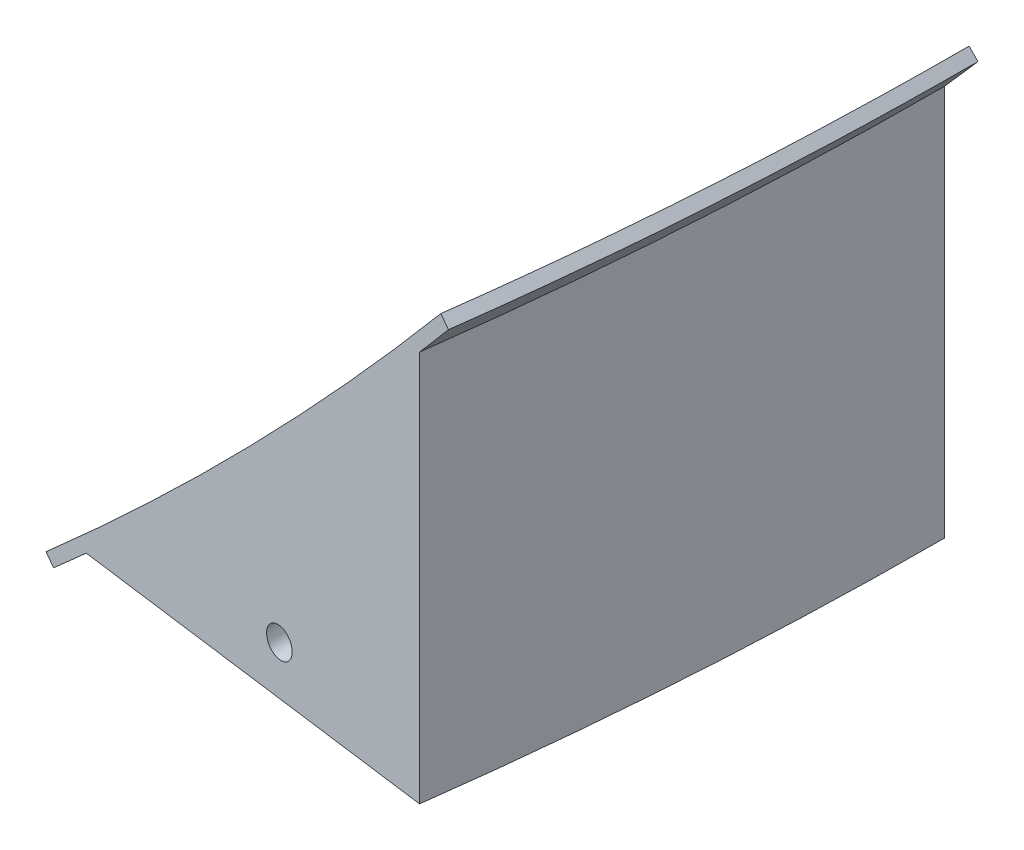
ISO-10303-21;
HEADER;
FILE_DESCRIPTION(('STEP AP214'),'2;1');
FILE_NAME('part.step','',(''),(''),'','','');
FILE_SCHEMA(('AUTOMOTIVE_DESIGN { 1 0 10303 214 1 1 1 1 }'));
ENDSEC;
DATA;
#1=APPLICATION_CONTEXT('core data for automotive mechanical design processes');
#2=APPLICATION_PROTOCOL_DEFINITION('international standard','automotive_design',2000,#1);
#3=PRODUCT_CONTEXT('',#1,'mechanical');
#4=PRODUCT('Part','Part','',(#3));
#5=PRODUCT_RELATED_PRODUCT_CATEGORY('part','',(#4));
#6=PRODUCT_DEFINITION_FORMATION('','',#4);
#7=PRODUCT_DEFINITION_CONTEXT('part definition',#1,'design');
#8=PRODUCT_DEFINITION('design','',#6,#7);
#9=PRODUCT_DEFINITION_SHAPE('','',#8);
#10=(LENGTH_UNIT() NAMED_UNIT(*) SI_UNIT(.MILLI.,.METRE.));
#11=(NAMED_UNIT(*) PLANE_ANGLE_UNIT() SI_UNIT($,.RADIAN.));
#12=(NAMED_UNIT(*) SI_UNIT($,.STERADIAN.) SOLID_ANGLE_UNIT());
#13=UNCERTAINTY_MEASURE_WITH_UNIT(LENGTH_MEASURE(1.E-05),#10,'distance_accuracy_value','');
#14=(GEOMETRIC_REPRESENTATION_CONTEXT(3) GLOBAL_UNCERTAINTY_ASSIGNED_CONTEXT((#13)) GLOBAL_UNIT_ASSIGNED_CONTEXT((#10,
#11,#12)) REPRESENTATION_CONTEXT('',''));
#15=CARTESIAN_POINT('',(0.,0.,0.));
#16=DIRECTION('',(0.,0.,1.));
#17=DIRECTION('',(1.,0.,0.));
#18=AXIS2_PLACEMENT_3D('',#15,#16,#17);
#19=CARTESIAN_POINT('',(0.,0.,0.));
#20=DIRECTION('',(0.,1.,0.));
#21=DIRECTION('',(0.99144486137381,0.,0.130526192220052));
#22=AXIS2_PLACEMENT_3D('',#19,#20,#21);
#23=SPHERICAL_SURFACE('',#22,990.6);
#24=CARTESIAN_POINT('',(0.,0.,0.));
#25=DIRECTION('',(0.,0.,-1.));
#26=DIRECTION('',(-1.,0.,0.));
#27=AXIS2_PLACEMENT_3D('',#24,#25,#26);
#28=CIRCLE('',#27,990.6);
#29=CARTESIAN_POINT('',(747.83996089819,-649.633552769401,0.));
#30=VERTEX_POINT('',#29);
#31=CARTESIAN_POINT('',(657.550535136958,-740.888421924044,0.));
#32=VERTEX_POINT('',#31);
#33=EDGE_CURVE('E130',#30,#32,#28,.T.);
#34=ORIENTED_EDGE('',*,*,#33,.T.);
#35=CARTESIAN_POINT('',(657.550535136958,-740.888421924044,0.));
#36=CARTESIAN_POINT('',(657.550536091288,-740.888423268421,3.59944655148366));
#37=CARTESIAN_POINT('',(657.52102394074,-740.888382851914,7.19888875757097));
#38=CARTESIAN_POINT('',(657.403000127714,-740.888212828207,14.3967455764021));
#39=CARTESIAN_POINT('',(657.31448945183,-740.8880832225,17.9951602053228));
#40=CARTESIAN_POINT('',(657.078495278586,-740.887729151888,25.1900635834792));
#41=CARTESIAN_POINT('',(656.931011778394,-740.887504686979,28.7865523326225));
#42=CARTESIAN_POINT('',(656.577109024732,-740.886966509601,35.976655543251));
#43=CARTESIAN_POINT('',(656.370688794431,-740.886652795653,39.5702699561062));
#44=CARTESIAN_POINT('',(655.666524765914,-740.885594755832,50.2927849919093));
#45=CARTESIAN_POINT('',(655.082138709881,-740.884730711083,57.4161792530851));
#46=CARTESIAN_POINT('',(653.681815145169,-740.882648434884,71.6411227293097));
#47=CARTESIAN_POINT('',(652.865847031347,-740.881430156619,78.7426689315129));
#48=CARTESIAN_POINT('',(651.93448684455,-740.880018194558,85.8288034564424));
#49=B_SPLINE_CURVE_WITH_KNOTS('',3,(#35,#36,#37,#38,#39,#40,#41,#42,#43,#44,#45,#46,#47,#48),
.UNSPECIFIED.,.F.,.F.,(4,2,2,2,2,2,4),(0.,10.7982101222248,21.5962396776766,32.3942697517743,
43.1924788053286,64.6304225738239,86.071200832552),.UNSPECIFIED.);
#50=CARTESIAN_POINT('',(651.93448684455,-740.880018194558,85.8288034564424));
#51=VERTEX_POINT('',#50);
#52=EDGE_CURVE('E52',#32,#51,#49,.T.);
#53=ORIENTED_EDGE('',*,*,#52,.T.);
#54=CARTESIAN_POINT('',(0.,0.,0.));
#55=DIRECTION('',(0.130526192220052,0.,-0.99144486137381));
#56=DIRECTION('',(-0.99144486137381,0.,-0.130526192220052));
#57=AXIS2_PLACEMENT_3D('',#54,#55,#56);
#58=CIRCLE('',#57,990.6);
#59=CARTESIAN_POINT('',(741.451031699921,-649.623166143906,97.6138801620462));
#60=VERTEX_POINT('',#59);
#61=EDGE_CURVE('E132',#60,#51,#58,.T.);
#62=ORIENTED_EDGE('',*,*,#61,.F.);
#63=CARTESIAN_POINT('',(741.451031699921,-649.623166143906,97.6138801620462));
#64=CARTESIAN_POINT('',(741.984510847553,-649.624045061227,93.5558755083255));
#65=CARTESIAN_POINT('',(742.484716606062,-649.624869657589,89.4935039820626));
#66=CARTESIAN_POINT('',(743.418457868094,-649.626405045488,81.3611748245032));
#67=CARTESIAN_POINT('',(743.851994486663,-649.627115838928,77.2912173212353));
#68=CARTESIAN_POINT('',(744.652291872864,-649.628418487868,69.144727755465));
#69=CARTESIAN_POINT('',(745.01905263613,-649.62901034336,65.0681956925327));
#70=CARTESIAN_POINT('',(745.685698029203,-649.630082374367,56.9096561255928));
#71=CARTESIAN_POINT('',(745.98558154992,-649.63056254803,52.8276485319083));
#72=CARTESIAN_POINT('',(746.781069574519,-649.631847518431,40.6316312358823));
#73=CARTESIAN_POINT('',(747.17808028781,-649.632505524804,32.5108746276513));
#74=CARTESIAN_POINT('',(747.575169172641,-649.633145785505,20.3231823803407));
#75=CARTESIAN_POINT('',(747.674460940531,-649.633301412712,16.2591713583255));
#76=CARTESIAN_POINT('',(747.806854921753,-649.633505422877,8.13014109860808));
#77=CARTESIAN_POINT('',(747.839958271164,-649.633553807675,4.06512187940866));
#78=CARTESIAN_POINT('',(747.839960898189,-649.633552769401,0.));
#79=B_SPLINE_CURVE_WITH_KNOTS('',3,(#63,#64,#65,#66,#67,#68,#69,#70,#71,#72,#73,#74,#75,#76,#77,
#78),.UNSPECIFIED.,.F.,.F.,(4,2,2,2,2,2,2,4),(0.,12.2786110484196,24.5570167136157,
36.8354231814184,49.1140332589345,73.5002565560423,85.6954915364311,97.890517192474),.UNSPECIFIED.);
#80=EDGE_CURVE('E119',#60,#30,#79,.T.);
#81=ORIENTED_EDGE('',*,*,#80,.T.);
#82=EDGE_LOOP('',(#34,#53,#62,#81));
#83=FACE_BOUND('',#82,.T.);
#84=ADVANCED_FACE('F36',(#83),#23,.F.);
#85=CARTESIAN_POINT('',(0.,0.,0.));
#86=DIRECTION('',(0.,1.,0.));
#87=DIRECTION('',(0.99144486137381,0.,0.130526192220052));
#88=AXIS2_PLACEMENT_3D('',#85,#86,#87);
#89=SPHERICAL_SURFACE('',#88,993.075249624413);
#90=CARTESIAN_POINT('',(0.,0.,0.));
#91=DIRECTION('',(0.,0.,1.));
#92=DIRECTION('',(1.,0.,0.));
#93=AXIS2_PLACEMENT_3D('',#90,#91,#92);
#94=CIRCLE('',#93,993.075249624413);
#95=CARTESIAN_POINT('',(742.97310069151,-658.93051459576,0.));
#96=VERTEX_POINT('',#95);
#97=CARTESIAN_POINT('',(749.586604116427,-651.397247726602,0.));
#98=VERTEX_POINT('',#97);
#99=EDGE_CURVE('E153',#96,#98,#94,.T.);
#100=ORIENTED_EDGE('',*,*,#99,.T.);
#101=CARTESIAN_POINT('',(749.586604116427,-651.397247726602,0.));
#102=CARTESIAN_POINT('',(749.586605454425,-651.39724931977,4.09291958061841));
#103=CARTESIAN_POINT('',(749.553086488586,-651.397242102042,8.18583179006925));
#104=CARTESIAN_POINT('',(749.419036707602,-651.397203164307,16.3704898044526));
#105=CARTESIAN_POINT('',(749.318507020358,-651.397171444712,20.4622356278576));
#106=CARTESIAN_POINT('',(749.050464545899,-651.397076623271,28.6435472781627));
#107=CARTESIAN_POINT('',(748.882951755089,-651.397013521423,32.7331131049456));
#108=CARTESIAN_POINT('',(748.48098858665,-651.396861275789,40.9089646871464));
#109=CARTESIAN_POINT('',(748.24653709277,-651.396772131569,44.995250386726));
#110=CARTESIAN_POINT('',(747.444054794308,-651.396482655785,57.2289376037594));
#111=CARTESIAN_POINT('',(746.77627464116,-651.396259972327,65.3701179579835));
#112=CARTESIAN_POINT('',(745.575415560947,-651.395820726485,77.5623649925912));
#113=CARTESIAN_POINT('',(745.141884170866,-651.39565675538,81.6235497191031));
#114=CARTESIAN_POINT('',(744.208534428882,-651.395300763418,89.7382234113944));
#115=CARTESIAN_POINT('',(743.708717228914,-651.395108743048,93.7917125096693));
#116=CARTESIAN_POINT('',(743.17580419077,-651.394906208791,97.8409507682365));
#117=B_SPLINE_CURVE_WITH_KNOTS('',3,(#101,#102,#103,#104,#105,#106,#107,#108,#109,#110,#111,
#112,#113,#114,#115,#116),.UNSPECIFIED.,.F.,.F.,(4,2,2,2,2,2,2,4),(0.,12.2786068912708,
24.5570071184778,36.8354080046885,49.1140136541446,73.6143741756836,85.8667096631725,
98.1188322538009),.UNSPECIFIED.);
#118=CARTESIAN_POINT('',(743.17580419077,-651.394906208791,97.8409507682365));
#119=VERTEX_POINT('',#118);
#120=EDGE_CURVE('E60',#98,#119,#117,.T.);
#121=ORIENTED_EDGE('',*,*,#120,.T.);
#122=CARTESIAN_POINT('',(0.,0.,0.));
#123=DIRECTION('',(-0.130526192220052,0.,0.99144486137381));
#124=DIRECTION('',(0.99144486137381,0.,0.130526192220052));
#125=AXIS2_PLACEMENT_3D('',#122,#123,#124);
#126=CIRCLE('',#125,993.075249624413);
#127=CARTESIAN_POINT('',(736.616862819564,-658.93051459576,96.977449755188));
#128=VERTEX_POINT('',#127);
#129=EDGE_CURVE('E164',#128,#119,#126,.T.);
#130=ORIENTED_EDGE('',*,*,#129,.F.);
#131=CARTESIAN_POINT('',(2.02009226479567E-13,-658.93051459576,0.));
#132=DIRECTION('',(0.,1.,0.));
#133=DIRECTION('',(-1.,0.,0.));
#134=AXIS2_PLACEMENT_3D('',#131,#132,#133);
#135=CIRCLE('',#134,742.97310069151);
#136=EDGE_CURVE('E125',#128,#96,#135,.T.);
#137=ORIENTED_EDGE('',*,*,#136,.T.);
#138=EDGE_LOOP('',(#100,#121,#130,#137));
#139=FACE_BOUND('',#138,.T.);
#140=ADVANCED_FACE('F38',(#139),#89,.T.);
#141=CARTESIAN_POINT('',(0.,993.075249624412,0.));
#142=DIRECTION('',(0.,1.,0.));
#143=DIRECTION('',(-1.,0.,0.));
#144=AXIS2_PLACEMENT_3D('',#141,#142,#143);
#145=CYLINDRICAL_SURFACE('',#144,742.97310069151);
#146=CARTESIAN_POINT('',(2.11443239134794E-13,-735.965073962553,0.));
#147=DIRECTION('',(0.,1.,0.));
#148=DIRECTION('',(-1.,0.,0.));
#149=AXIS2_PLACEMENT_3D('',#146,#147,#148);
#150=CIRCLE('',#149,742.97310069151);
#151=CARTESIAN_POINT('',(736.616862819564,-735.965073962553,96.9774497551879));
#152=VERTEX_POINT('',#151);
#153=CARTESIAN_POINT('',(742.97310069151,-735.965073962553,0.));
#154=VERTEX_POINT('',#153);
#155=EDGE_CURVE('E170',#152,#154,#150,.T.);
#156=ORIENTED_EDGE('',*,*,#155,.T.);
#157=DIRECTION('',(0.,1.,0.));
#158=VECTOR('',#157,1.);
#159=CARTESIAN_POINT('',(742.97310069151,-658.93051459576,0.));
#160=LINE('',#159,#158);
#161=EDGE_CURVE('E150',#154,#96,#160,.T.);
#162=ORIENTED_EDGE('',*,*,#161,.T.);
#163=ORIENTED_EDGE('',*,*,#136,.F.);
#164=DIRECTION('',(0.,1.,0.));
#165=VECTOR('',#164,1.);
#166=CARTESIAN_POINT('',(736.616862819564,-658.93051459576,96.9774497551879));
#167=LINE('',#166,#165);
#168=EDGE_CURVE('E161',#152,#128,#167,.T.);
#169=ORIENTED_EDGE('',*,*,#168,.F.);
#170=EDGE_LOOP('',(#156,#162,#163,#169));
#171=FACE_BOUND('',#170,.T.);
#172=ADVANCED_FACE('F177',(#171),#145,.T.);
#173=CARTESIAN_POINT('',(736.616862819564,-735.965073962553,96.9774497551879));
#174=DIRECTION('',(0.,1.,0.));
#175=DIRECTION('',(-1.,0.,0.));
#176=AXIS2_PLACEMENT_3D('',#173,#174,#175);
#177=PLANE('',#176);
#178=DIRECTION('',(1.,0.,0.));
#179=VECTOR('',#178,1.);
#180=CARTESIAN_POINT('',(688.633501448751,-735.965073962553,42.5613904005498));
#181=LINE('',#180,#179);
#182=CARTESIAN_POINT('',(688.633501448751,-735.965073962553,42.5613904005498));
#183=VERTEX_POINT('',#182);
#184=CARTESIAN_POINT('',(721.883501448751,-735.965073962553,42.5613904005498));
#185=VERTEX_POINT('',#184);
#186=EDGE_CURVE('E282',#183,#185,#181,.T.);
#187=ORIENTED_EDGE('',*,*,#186,.F.);
#188=DIRECTION('',(0.,0.,-1.));
#189=VECTOR('',#188,1.);
#190=CARTESIAN_POINT('',(688.633501448751,-735.965073962553,42.5613904005498));
#191=LINE('',#190,#189);
#192=CARTESIAN_POINT('',(688.633501448751,-735.965073962553,55.5613904005498));
#193=VERTEX_POINT('',#192);
#194=EDGE_CURVE('E190',#193,#183,#191,.T.);
#195=ORIENTED_EDGE('',*,*,#194,.F.);
#196=DIRECTION('',(-1.,0.,0.));
#197=VECTOR('',#196,1.);
#198=CARTESIAN_POINT('',(688.633501448751,-735.965073962553,55.5613904005498));
#199=LINE('',#198,#197);
#200=CARTESIAN_POINT('',(721.883501448751,-735.965073962553,55.5613904005498));
#201=VERTEX_POINT('',#200);
#202=EDGE_CURVE('E289',#201,#193,#199,.T.);
#203=ORIENTED_EDGE('',*,*,#202,.F.);
#204=DIRECTION('',(0.,0.,1.));
#205=VECTOR('',#204,1.);
#206=CARTESIAN_POINT('',(721.883501448751,-735.965073962553,42.5613904005498));
#207=LINE('',#206,#205);
#208=EDGE_CURVE('E285',#185,#201,#207,.T.);
#209=ORIENTED_EDGE('',*,*,#208,.F.);
#210=EDGE_LOOP('',(#187,#195,#203,#209));
#211=FACE_BOUND('',#210,.T.);
#212=CARTESIAN_POINT('',(2.11443239134794E-13,-735.965073962553,0.));
#213=DIRECTION('',(0.,1.,0.));
#214=DIRECTION('',(-1.,0.,0.));
#215=AXIS2_PLACEMENT_3D('',#212,#213,#214);
#216=CIRCLE('',#215,666.748724276157);
#217=CARTESIAN_POINT('',(661.044596511139,-735.965073962553,87.028172147344));
#218=VERTEX_POINT('',#217);
#219=CARTESIAN_POINT('',(666.748724276157,-735.965073962553,0.));
#220=VERTEX_POINT('',#219);
#221=EDGE_CURVE('E167',#218,#220,#216,.T.);
#222=ORIENTED_EDGE('',*,*,#221,.T.);
#223=DIRECTION('',(1.,0.,0.));
#224=VECTOR('',#223,1.);
#225=CARTESIAN_POINT('',(742.97310069151,-735.965073962553,0.));
#226=LINE('',#225,#224);
#227=EDGE_CURVE('E140',#220,#154,#226,.T.);
#228=ORIENTED_EDGE('',*,*,#227,.T.);
#229=ORIENTED_EDGE('',*,*,#155,.F.);
#230=DIRECTION('',(0.99144486137381,0.,0.130526192220052));
#231=VECTOR('',#230,1.);
#232=CARTESIAN_POINT('',(736.616862819564,-735.965073962553,96.9774497551879));
#233=LINE('',#232,#231);
#234=EDGE_CURVE('E158',#218,#152,#233,.T.);
#235=ORIENTED_EDGE('',*,*,#234,.F.);
#236=EDGE_LOOP('',(#222,#228,#229,#235));
#237=FACE_BOUND('',#236,.T.);
#238=ADVANCED_FACE('F180',(#211,#237),#177,.F.);
#239=CARTESIAN_POINT('',(0.,0.,0.));
#240=DIRECTION('',(0.,1.,0.));
#241=DIRECTION('',(-0.99144486137381,0.,-0.130526192220052));
#242=AXIS2_PLACEMENT_3D('',#239,#240,#241);
#243=SPHERICAL_SURFACE('',#242,993.075249624412);
#244=CARTESIAN_POINT('',(0.,0.,0.));
#245=DIRECTION('',(-0.130526192220052,0.,0.99144486137381));
#246=DIRECTION('',(0.99144486137381,0.,0.130526192220052));
#247=AXIS2_PLACEMENT_3D('',#244,#245,#246);
#248=CIRCLE('',#247,993.075249624412);
#249=CARTESIAN_POINT('',(653.656028645542,-742.648441306568,86.0554487342441));
#250=VERTEX_POINT('',#249);
#251=EDGE_CURVE('E156',#250,#218,#248,.T.);
#252=ORIENTED_EDGE('',*,*,#251,.F.);
#253=CARTESIAN_POINT('',(653.656028645541,-742.648441306569,86.0554487342442));
#254=CARTESIAN_POINT('',(654.125730811798,-742.648550679641,82.4867814804818));
#255=CARTESIAN_POINT('',(654.566206059452,-742.648657004871,78.9142718673128));
#256=CARTESIAN_POINT('',(655.388597306497,-742.648857030896,71.7625797192371));
#257=CARTESIAN_POINT('',(655.770514291412,-742.648950731903,68.183397297659));
#258=CARTESIAN_POINT('',(656.475699434926,-742.649118984853,61.0192509837128));
#259=CARTESIAN_POINT('',(656.798967591088,-742.649193536795,57.4342870911045));
#260=CARTESIAN_POINT('',(657.386768963161,-742.649328405063,50.2595206282547));
#261=CARTESIAN_POINT('',(657.651301199363,-742.64938872115,46.6697179783079));
#262=CARTESIAN_POINT('',(658.355696035679,-742.649558454821,35.9091485862202));
#263=CARTESIAN_POINT('',(658.707810135016,-742.64965695159,28.7324500894992));
#264=CARTESIAN_POINT('',(659.17743267145,-742.649785970504,14.3704189706097));
#265=CARTESIAN_POINT('',(659.294909673904,-742.649816483541,7.18508532058599));
#266=CARTESIAN_POINT('',(659.294877513673,-742.649793577579,0.));
#267=B_SPLINE_CURVE_WITH_KNOTS('',3,(#253,#254,#255,#256,#257,#258,#259,#260,#261,#262,#263,
#264,#265,#266),.UNSPECIFIED.,.F.,.F.,(4,2,2,2,2,2,4),(0.,10.7982064114039,21.596231070932,
32.3942561789529,43.1924613831773,64.7443685266857,86.2991628140015),.UNSPECIFIED.);
#268=CARTESIAN_POINT('',(659.294877513672,-742.649793577579,0.));
#269=VERTEX_POINT('',#268);
#270=EDGE_CURVE('E187',#250,#269,#267,.T.);
#271=ORIENTED_EDGE('',*,*,#270,.T.);
#272=CARTESIAN_POINT('',(0.,0.,0.));
#273=DIRECTION('',(0.,0.,1.));
#274=DIRECTION('',(1.,0.,0.));
#275=AXIS2_PLACEMENT_3D('',#272,#273,#274);
#276=CIRCLE('',#275,993.075249624412);
#277=EDGE_CURVE('E137',#269,#220,#276,.T.);
#278=ORIENTED_EDGE('',*,*,#277,.T.);
#279=ORIENTED_EDGE('',*,*,#221,.F.);
#280=EDGE_LOOP('',(#252,#271,#278,#279));
#281=FACE_BOUND('',#280,.T.);
#282=ADVANCED_FACE('F185',(#281),#243,.T.);
#283=CARTESIAN_POINT('',(0.,0.,0.));
#284=DIRECTION('',(0.130526192220052,0.,-0.99144486137381));
#285=DIRECTION('',(-0.99144486137381,0.,-0.130526192220052));
#286=AXIS2_PLACEMENT_3D('',#283,#284,#285);
#287=PLANE('',#286);
#288=CARTESIAN_POINT('',(704.851033101086,-726.404105814993,92.7953989348144));
#289=DIRECTION('',(0.130526192220052,0.,-0.99144486137381));
#290=DIRECTION('',(-0.99144486137381,0.,-0.130526192220052));
#291=AXIS2_PLACEMENT_3D('',#288,#289,#290);
#292=ELLIPSE('',#291,2.92933838443865,2.90427748847675);
#293=CARTESIAN_POINT('',(701.946755612609,-726.404105814993,92.4130435497696));
#294=VERTEX_POINT('',#293);
#295=EDGE_CURVE('E229',#294,#294,#292,.T.);
#296=ORIENTED_EDGE('',*,*,#295,.T.);
#297=EDGE_LOOP('',(#296));
#298=FACE_BOUND('',#297,.T.);
#299=ORIENTED_EDGE('',*,*,#61,.T.);
#300=CARTESIAN_POINT('',(521.328953973844,-606.952332996667,68.6342588552812));
#301=CARTESIAN_POINT('',(543.455508937041,-629.602598564704,71.5472750791908));
#302=CARTESIAN_POINT('',(565.572219330063,-652.262630636929,74.4589952408493));
#303=CARTESIAN_POINT('',(609.785950975759,-697.602227789755,80.2798434396641));
#304=CARTESIAN_POINT('',(631.882972228432,-720.281792870356,83.1889714768204));
#305=CARTESIAN_POINT('',(653.970148910932,-742.971124455145,86.0968034517256));
#306=B_SPLINE_CURVE_WITH_KNOTS('',3,(#300,#301,#302,#303,#304,#305),.UNSPECIFIED.,.F.,.F.,(4,2,
4),(0.,95.3935868798635,190.787173759727),.UNSPECIFIED.);
#307=EDGE_CURVE('E133',#51,#250,#306,.T.);
#308=ORIENTED_EDGE('',*,*,#307,.T.);
#309=ORIENTED_EDGE('',*,*,#251,.T.);
#310=ORIENTED_EDGE('',*,*,#234,.T.);
#311=ORIENTED_EDGE('',*,*,#168,.T.);
#312=ORIENTED_EDGE('',*,*,#129,.T.);
#313=CARTESIAN_POINT('',(743.691310419772,-651.924464103168,97.9088184508065));
#314=CARTESIAN_POINT('',(724.838358626789,-632.557518787203,95.4267802603655));
#315=CARTESIAN_POINT('',(705.979095450318,-613.196832070289,92.9439111605251));
#316=CARTESIAN_POINT('',(668.247946330402,-574.487975834562,87.9765111420456));
#317=CARTESIAN_POINT('',(649.376060386956,-555.139806315749,85.4919802234065));
#318=CARTESIAN_POINT('',(630.497863060022,-535.797895395987,83.0066183953681));
#319=B_SPLINE_CURVE_WITH_KNOTS('',3,(#313,#314,#315,#316,#317,#318),.UNSPECIFIED.,.F.,.F.,(4,2,
4),(0.,81.4251418794675,162.850283758935),.UNSPECIFIED.);
#320=EDGE_CURVE('E238',#119,#60,#319,.T.);
#321=ORIENTED_EDGE('',*,*,#320,.T.);
#322=EDGE_LOOP('',(#299,#308,#309,#310,#311,#312,#321));
#323=FACE_BOUND('',#322,.T.);
#324=ADVANCED_FACE('F251',(#298,#323),#287,.F.);
#325=CARTESIAN_POINT('',(0.,0.,0.));
#326=DIRECTION('',(0.,0.,-1.));
#327=DIRECTION('',(-1.,0.,0.));
#328=AXIS2_PLACEMENT_3D('',#325,#326,#327);
#329=PLANE('',#328);
#330=CARTESIAN_POINT('',(704.851033101086,-726.404105814993,0.));
#331=DIRECTION('',(0.,0.,-1.));
#332=DIRECTION('',(-1.,0.,0.));
#333=AXIS2_PLACEMENT_3D('',#330,#331,#332);
#334=CIRCLE('',#333,2.90427748847675);
#335=CARTESIAN_POINT('',(701.946755612609,-726.404105814993,0.));
#336=VERTEX_POINT('',#335);
#337=EDGE_CURVE('E339',#336,#336,#334,.T.);
#338=ORIENTED_EDGE('',*,*,#337,.F.);
#339=EDGE_LOOP('',(#338));
#340=FACE_BOUND('',#339,.T.);
#341=DIRECTION('',(0.703663653557431,-0.710533224179002,0.));
#342=VECTOR('',#341,1.);
#343=CARTESIAN_POINT('',(-38.4574345876461,-38.0856207810088,0.));
#344=LINE('',#343,#342);
#345=EDGE_CURVE('E11',#32,#269,#344,.T.);
#346=ORIENTED_EDGE('',*,*,#345,.F.);
#347=ORIENTED_EDGE('',*,*,#33,.F.);
#348=DIRECTION('',(0.703663653557431,-0.710533224179002,0.));
#349=VECTOR('',#348,1.);
#350=CARTESIAN_POINT('',(579.678119509669,-479.830018450697,0.));
#351=LINE('',#350,#349);
#352=EDGE_CURVE('E46',#98,#30,#351,.F.);
#353=ORIENTED_EDGE('',*,*,#352,.F.);
#354=ORIENTED_EDGE('',*,*,#99,.F.);
#355=ORIENTED_EDGE('',*,*,#161,.F.);
#356=ORIENTED_EDGE('',*,*,#227,.F.);
#357=ORIENTED_EDGE('',*,*,#277,.F.);
#358=EDGE_LOOP('',(#346,#347,#353,#354,#355,#356,#357));
#359=FACE_BOUND('',#358,.T.);
#360=ADVANCED_FACE('F135',(#340,#359),#329,.T.);
#361=CARTESIAN_POINT('',(688.633501448751,-716.965073962553,42.5613904005498));
#362=DIRECTION('',(-1.,0.,0.));
#363=DIRECTION('',(0.,-1.,0.));
#364=AXIS2_PLACEMENT_3D('',#361,#362,#363);
#365=PLANE('',#364);
#366=ORIENTED_EDGE('',*,*,#194,.T.);
#367=DIRECTION('',(0.,-1.,0.));
#368=VECTOR('',#367,1.);
#369=CARTESIAN_POINT('',(688.633501448751,-716.965073962553,42.5613904005498));
#370=LINE('',#369,#368);
#371=CARTESIAN_POINT('',(688.633501448751,-716.965073962553,42.5613904005498));
#372=VERTEX_POINT('',#371);
#373=EDGE_CURVE('E145',#372,#183,#370,.T.);
#374=ORIENTED_EDGE('',*,*,#373,.F.);
#375=DIRECTION('',(0.,0.,-1.));
#376=VECTOR('',#375,1.);
#377=CARTESIAN_POINT('',(688.633501448751,-716.965073962553,42.5613904005498));
#378=LINE('',#377,#376);
#379=CARTESIAN_POINT('',(688.633501448751,-716.965073962553,55.5613904005498));
#380=VERTEX_POINT('',#379);
#381=EDGE_CURVE('E295',#380,#372,#378,.T.);
#382=ORIENTED_EDGE('',*,*,#381,.F.);
#383=DIRECTION('',(0.,-1.,0.));
#384=VECTOR('',#383,1.);
#385=CARTESIAN_POINT('',(688.633501448751,-716.965073962553,55.5613904005498));
#386=LINE('',#385,#384);
#387=EDGE_CURVE('E138',#380,#193,#386,.T.);
#388=ORIENTED_EDGE('',*,*,#387,.T.);
#389=EDGE_LOOP('',(#366,#374,#382,#388));
#390=FACE_BOUND('',#389,.T.);
#391=ADVANCED_FACE('F315',(#390),#365,.F.);
#392=CARTESIAN_POINT('',(688.633501448751,-716.965073962553,55.5613904005498));
#393=DIRECTION('',(0.,0.,1.));
#394=DIRECTION('',(1.,0.,0.));
#395=AXIS2_PLACEMENT_3D('',#392,#393,#394);
#396=PLANE('',#395);
#397=CARTESIAN_POINT('',(704.851033101086,-726.404105814993,55.5613904005498));
#398=DIRECTION('',(0.,0.,1.));
#399=DIRECTION('',(1.,0.,0.));
#400=AXIS2_PLACEMENT_3D('',#397,#398,#399);
#401=CIRCLE('',#400,2.90427748847675);
#402=CARTESIAN_POINT('',(707.755310589563,-726.404105814993,55.5613904005498));
#403=VERTEX_POINT('',#402);
#404=EDGE_CURVE('E338',#403,#403,#401,.T.);
#405=ORIENTED_EDGE('',*,*,#404,.T.);
#406=EDGE_LOOP('',(#405));
#407=FACE_BOUND('',#406,.T.);
#408=ORIENTED_EDGE('',*,*,#202,.T.);
#409=ORIENTED_EDGE('',*,*,#387,.F.);
#410=DIRECTION('',(-1.,0.,0.));
#411=VECTOR('',#410,1.);
#412=CARTESIAN_POINT('',(688.633501448751,-716.965073962553,55.5613904005498));
#413=LINE('',#412,#411);
#414=CARTESIAN_POINT('',(721.883501448751,-716.965073962553,55.5613904005498));
#415=VERTEX_POINT('',#414);
#416=EDGE_CURVE('E300',#415,#380,#413,.T.);
#417=ORIENTED_EDGE('',*,*,#416,.F.);
#418=DIRECTION('',(0.,-1.,0.));
#419=VECTOR('',#418,1.);
#420=CARTESIAN_POINT('',(721.883501448751,-716.965073962553,55.5613904005498));
#421=LINE('',#420,#419);
#422=EDGE_CURVE('E142',#415,#201,#421,.T.);
#423=ORIENTED_EDGE('',*,*,#422,.T.);
#424=EDGE_LOOP('',(#408,#409,#417,#423));
#425=FACE_BOUND('',#424,.T.);
#426=ADVANCED_FACE('F319',(#407,#425),#396,.F.);
#427=CARTESIAN_POINT('',(721.883501448751,-716.965073962553,42.5613904005498));
#428=DIRECTION('',(1.,0.,0.));
#429=DIRECTION('',(0.,1.,0.));
#430=AXIS2_PLACEMENT_3D('',#427,#428,#429);
#431=PLANE('',#430);
#432=ORIENTED_EDGE('',*,*,#208,.T.);
#433=ORIENTED_EDGE('',*,*,#422,.F.);
#434=DIRECTION('',(0.,0.,1.));
#435=VECTOR('',#434,1.);
#436=CARTESIAN_POINT('',(721.883501448751,-716.965073962553,42.5613904005498));
#437=LINE('',#436,#435);
#438=CARTESIAN_POINT('',(721.883501448751,-716.965073962553,42.5613904005498));
#439=VERTEX_POINT('',#438);
#440=EDGE_CURVE('E303',#439,#415,#437,.T.);
#441=ORIENTED_EDGE('',*,*,#440,.F.);
#442=DIRECTION('',(0.,-1.,0.));
#443=VECTOR('',#442,1.);
#444=CARTESIAN_POINT('',(721.883501448751,-716.965073962553,42.5613904005498));
#445=LINE('',#444,#443);
#446=EDGE_CURVE('E297',#439,#185,#445,.T.);
#447=ORIENTED_EDGE('',*,*,#446,.T.);
#448=EDGE_LOOP('',(#432,#433,#441,#447));
#449=FACE_BOUND('',#448,.T.);
#450=ADVANCED_FACE('F317',(#449),#431,.F.);
#451=CARTESIAN_POINT('',(688.633501448751,-716.965073962553,42.5613904005498));
#452=DIRECTION('',(0.,0.,-1.));
#453=DIRECTION('',(-1.,0.,0.));
#454=AXIS2_PLACEMENT_3D('',#451,#452,#453);
#455=PLANE('',#454);
#456=CARTESIAN_POINT('',(704.851033101086,-726.404105814993,42.5613904005498));
#457=DIRECTION('',(0.,0.,-1.));
#458=DIRECTION('',(-1.,0.,0.));
#459=AXIS2_PLACEMENT_3D('',#456,#457,#458);
#460=CIRCLE('',#459,2.90427748847675);
#461=CARTESIAN_POINT('',(701.946755612609,-726.404105814993,42.5613904005498));
#462=VERTEX_POINT('',#461);
#463=EDGE_CURVE('E41',#462,#462,#460,.T.);
#464=ORIENTED_EDGE('',*,*,#463,.T.);
#465=EDGE_LOOP('',(#464));
#466=FACE_BOUND('',#465,.T.);
#467=ORIENTED_EDGE('',*,*,#186,.T.);
#468=ORIENTED_EDGE('',*,*,#446,.F.);
#469=DIRECTION('',(1.,0.,0.));
#470=VECTOR('',#469,1.);
#471=CARTESIAN_POINT('',(688.633501448751,-716.965073962553,42.5613904005498));
#472=LINE('',#471,#470);
#473=EDGE_CURVE('E308',#372,#439,#472,.T.);
#474=ORIENTED_EDGE('',*,*,#473,.F.);
#475=ORIENTED_EDGE('',*,*,#373,.T.);
#476=EDGE_LOOP('',(#467,#468,#474,#475));
#477=FACE_BOUND('',#476,.T.);
#478=ADVANCED_FACE('F316',(#466,#477),#455,.F.);
#479=CARTESIAN_POINT('',(0.,-716.965073962553,0.));
#480=DIRECTION('',(0.,1.,0.));
#481=DIRECTION('',(0.,0.,1.));
#482=AXIS2_PLACEMENT_3D('',#479,#480,#481);
#483=PLANE('',#482);
#484=ORIENTED_EDGE('',*,*,#381,.T.);
#485=ORIENTED_EDGE('',*,*,#473,.T.);
#486=ORIENTED_EDGE('',*,*,#440,.T.);
#487=ORIENTED_EDGE('',*,*,#416,.T.);
#488=EDGE_LOOP('',(#484,#485,#486,#487));
#489=FACE_BOUND('',#488,.T.);
#490=ADVANCED_FACE('F313',(#489),#483,.F.);
#491=CARTESIAN_POINT('',(576.438240743978,-483.03857345104,97.9088184508065));
#492=CARTESIAN_POINT('',(577.516723277929,-481.970517891761,81.6826779089618));
#493=CARTESIAN_POINT('',(578.326969417593,-481.168105366188,65.3875982555718));
#494=CARTESIAN_POINT('',(579.407667715011,-480.097855465863,32.7283409353068));
#495=CARTESIAN_POINT('',(579.678119509669,-479.830018450697,16.3641728786069));
#496=CARTESIAN_POINT('',(579.678119509669,-479.830018450697,0.));
#497=B_SPLINE_CURVE_WITH_KNOTS('',3,(#491,#492,#493,#494,#495,#496),.UNSPECIFIED.,.F.,.F.,(4,2,
4),(0.,0.5,1.),.UNSPECIFIED.);
#498=DIRECTION('',(0.703663653557431,-0.710533224179002,0.));
#499=VECTOR('',#498,1.);
#500=SURFACE_OF_LINEAR_EXTRUSION('',#497,#499);
#501=ORIENTED_EDGE('',*,*,#320,.F.);
#502=ORIENTED_EDGE('',*,*,#120,.F.);
#503=ORIENTED_EDGE('',*,*,#352,.T.);
#504=ORIENTED_EDGE('',*,*,#80,.F.);
#505=EDGE_LOOP('',(#501,#502,#503,#504));
#506=FACE_BOUND('',#505,.T.);
#507=ADVANCED_FACE('F118',(#506),#500,.F.);
#508=CARTESIAN_POINT('',(488.469547741594,-570.156768364802,0.));
#509=CARTESIAN_POINT('',(488.469547741594,-570.156768364802,14.3911863500293));
#510=CARTESIAN_POINT('',(488.231695964348,-570.392320545737,28.7823681179034));
#511=CARTESIAN_POINT('',(487.281355987054,-571.333472455018,57.5021300850453));
#512=CARTESIAN_POINT('',(486.56886804494,-572.039071927926,71.8307011266331));
#513=CARTESIAN_POINT('',(485.620660913029,-572.97811161258,86.0968034517255));
#514=B_SPLINE_CURVE_WITH_KNOTS('',3,(#508,#509,#510,#511,#512,#513),.UNSPECIFIED.,.F.,.F.,(4,2,
4),(0.,0.5,1.),.UNSPECIFIED.);
#515=DIRECTION('',(0.703663653557431,-0.710533224179002,0.));
#516=VECTOR('',#515,1.);
#517=SURFACE_OF_LINEAR_EXTRUSION('',#514,#516);
#518=ORIENTED_EDGE('',*,*,#345,.T.);
#519=ORIENTED_EDGE('',*,*,#270,.F.);
#520=ORIENTED_EDGE('',*,*,#307,.F.);
#521=ORIENTED_EDGE('',*,*,#52,.F.);
#522=EDGE_LOOP('',(#518,#519,#520,#521));
#523=FACE_BOUND('',#522,.T.);
#524=ADVANCED_FACE('F212',(#523),#517,.F.);
#525=CARTESIAN_POINT('',(704.851033101086,-726.404105814993,97.8409507682365));
#526=DIRECTION('',(0.,0.,-1.));
#527=DIRECTION('',(-1.,0.,0.));
#528=AXIS2_PLACEMENT_3D('',#525,#526,#527);
#529=CYLINDRICAL_SURFACE('',#528,2.90427748847675);
#530=ORIENTED_EDGE('',*,*,#337,.T.);
#531=EDGE_LOOP('',(#530));
#532=FACE_BOUND('',#531,.T.);
#533=ORIENTED_EDGE('',*,*,#463,.F.);
#534=EDGE_LOOP('',(#533));
#535=FACE_BOUND('',#534,.T.);
#536=ADVANCED_FACE('F218',(#532,#535),#529,.F.);
#537=ORIENTED_EDGE('',*,*,#404,.F.);
#538=EDGE_LOOP('',(#537));
#539=FACE_BOUND('',#538,.T.);
#540=ORIENTED_EDGE('',*,*,#295,.F.);
#541=EDGE_LOOP('',(#540));
#542=FACE_BOUND('',#541,.T.);
#543=ADVANCED_FACE('F219',(#539,#542),#529,.F.);
#544=CLOSED_SHELL('',(#84,#140,#172,#238,#282,#324,#360,#391,#426,#450,#478,#490,#507,#524,#536,#543));
#545=MANIFOLD_SOLID_BREP('B2',#544);
#546=ADVANCED_BREP_SHAPE_REPRESENTATION('',(#18,#545),#14);
#547=SHAPE_DEFINITION_REPRESENTATION(#9,#546);
ENDSEC;
END-ISO-10303-21;
